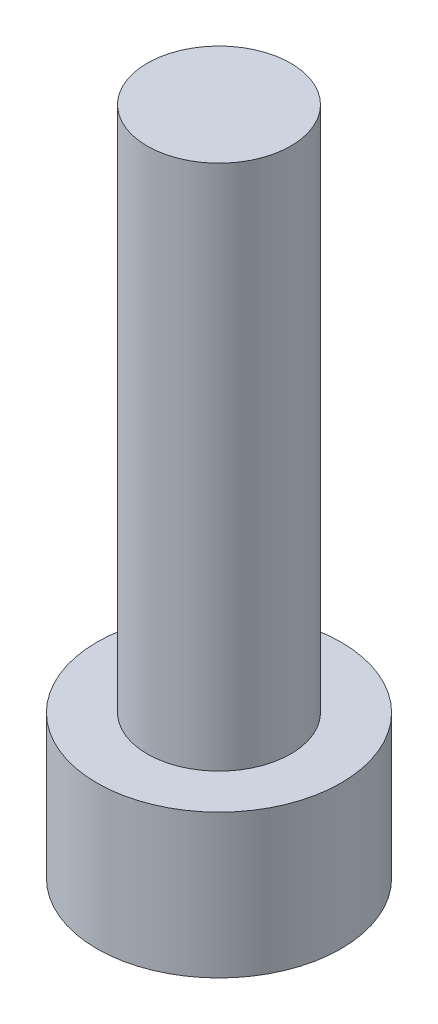
ISO-10303-21;
HEADER;
FILE_DESCRIPTION(('STEP AP214'),'2;1');
FILE_NAME('part.step','',(''),(''),'','','');
FILE_SCHEMA(('AUTOMOTIVE_DESIGN { 1 0 10303 214 1 1 1 1 }'));
ENDSEC;
DATA;
#1=APPLICATION_CONTEXT('core data for automotive mechanical design processes');
#2=APPLICATION_PROTOCOL_DEFINITION('international standard','automotive_design',2000,#1);
#3=PRODUCT_CONTEXT('',#1,'mechanical');
#4=PRODUCT('Part','Part','',(#3));
#5=PRODUCT_RELATED_PRODUCT_CATEGORY('part','',(#4));
#6=PRODUCT_DEFINITION_FORMATION('','',#4);
#7=PRODUCT_DEFINITION_CONTEXT('part definition',#1,'design');
#8=PRODUCT_DEFINITION('design','',#6,#7);
#9=PRODUCT_DEFINITION_SHAPE('','',#8);
#10=(LENGTH_UNIT() NAMED_UNIT(*) SI_UNIT(.MILLI.,.METRE.));
#11=(NAMED_UNIT(*) PLANE_ANGLE_UNIT() SI_UNIT($,.RADIAN.));
#12=(NAMED_UNIT(*) SI_UNIT($,.STERADIAN.) SOLID_ANGLE_UNIT());
#13=UNCERTAINTY_MEASURE_WITH_UNIT(LENGTH_MEASURE(1.E-05),#10,'distance_accuracy_value','');
#14=(GEOMETRIC_REPRESENTATION_CONTEXT(3) GLOBAL_UNCERTAINTY_ASSIGNED_CONTEXT((#13)) GLOBAL_UNIT_ASSIGNED_CONTEXT((#10,
#11,#12)) REPRESENTATION_CONTEXT('',''));
#15=CARTESIAN_POINT('',(0.,0.,0.));
#16=DIRECTION('',(0.,0.,1.));
#17=DIRECTION('',(1.,0.,0.));
#18=AXIS2_PLACEMENT_3D('',#15,#16,#17);
#19=CARTESIAN_POINT('',(0.,6.,0.));
#20=DIRECTION('',(0.,-1.,0.));
#21=DIRECTION('',(0.,0.,-1.));
#22=AXIS2_PLACEMENT_3D('',#19,#20,#21);
#23=CYLINDRICAL_SURFACE('',#22,5.1);
#24=CARTESIAN_POINT('',(0.,6.,0.));
#25=DIRECTION('',(0.,1.,0.));
#26=DIRECTION('',(0.,0.,1.));
#27=AXIS2_PLACEMENT_3D('',#24,#25,#26);
#28=CIRCLE('',#27,5.1);
#29=CARTESIAN_POINT('',(0.,6.,5.1));
#30=VERTEX_POINT('',#29);
#31=EDGE_CURVE('E47',#30,#30,#28,.T.);
#32=ORIENTED_EDGE('',*,*,#31,.F.);
#33=EDGE_LOOP('',(#32));
#34=FACE_BOUND('',#33,.T.);
#35=CARTESIAN_POINT('',(0.,0.,0.));
#36=DIRECTION('',(0.,1.,0.));
#37=DIRECTION('',(0.,0.,1.));
#38=AXIS2_PLACEMENT_3D('',#35,#36,#37);
#39=CIRCLE('',#38,5.1);
#40=CARTESIAN_POINT('',(0.,0.,5.1));
#41=VERTEX_POINT('',#40);
#42=EDGE_CURVE('E42',#41,#41,#39,.T.);
#43=ORIENTED_EDGE('',*,*,#42,.T.);
#44=EDGE_LOOP('',(#43));
#45=FACE_BOUND('',#44,.T.);
#46=ADVANCED_FACE('F41',(#34,#45),#23,.T.);
#47=CARTESIAN_POINT('',(0.,6.,0.));
#48=DIRECTION('',(0.,1.,0.));
#49=DIRECTION('',(0.,0.,1.));
#50=AXIS2_PLACEMENT_3D('',#47,#48,#49);
#51=PLANE('',#50);
#52=CARTESIAN_POINT('',(0.,6.,0.));
#53=DIRECTION('',(0.,1.,0.));
#54=DIRECTION('',(0.,0.,1.));
#55=AXIS2_PLACEMENT_3D('',#52,#53,#54);
#56=CIRCLE('',#55,3.);
#57=CARTESIAN_POINT('',(0.,6.,3.));
#58=VERTEX_POINT('',#57);
#59=EDGE_CURVE('E11',#58,#58,#56,.T.);
#60=ORIENTED_EDGE('',*,*,#59,.F.);
#61=EDGE_LOOP('',(#60));
#62=FACE_BOUND('',#61,.T.);
#63=ORIENTED_EDGE('',*,*,#31,.T.);
#64=EDGE_LOOP('',(#63));
#65=FACE_BOUND('',#64,.T.);
#66=ADVANCED_FACE('F161',(#62,#65),#51,.T.);
#67=CARTESIAN_POINT('',(0.,0.,0.));
#68=DIRECTION('',(0.,1.,0.));
#69=DIRECTION('',(0.,0.,1.));
#70=AXIS2_PLACEMENT_3D('',#67,#68,#69);
#71=PLANE('',#70);
#72=DIRECTION('',(0.091692466270765,0.,0.995787372700209));
#73=VECTOR('',#72,1.);
#74=CARTESIAN_POINT('',(2.3571217565403,0.,-1.66652643488715));
#75=LINE('',#74,#73);
#76=CARTESIAN_POINT('',(2.3571217565403,0.,-1.66652643488715));
#77=VERTEX_POINT('',#76);
#78=CARTESIAN_POINT('',(2.62181510696074,0.,1.20806410353333));
#79=VERTEX_POINT('',#78);
#80=EDGE_CURVE('E133',#77,#79,#75,.T.);
#81=ORIENTED_EDGE('',*,*,#80,.F.);
#82=DIRECTION('',(0.908223394661526,0.,0.418485681223974));
#83=VECTOR('',#82,1.);
#84=CARTESIAN_POINT('',(-0.264693350420435,0.,-2.87459053842048));
#85=LINE('',#84,#83);
#86=CARTESIAN_POINT('',(-0.264693350420435,0.,-2.87459053842048));
#87=VERTEX_POINT('',#86);
#88=EDGE_CURVE('E60',#87,#77,#85,.T.);
#89=ORIENTED_EDGE('',*,*,#88,.F.);
#90=DIRECTION('',(0.816530928390761,0.,-0.577301691476235));
#91=VECTOR('',#90,1.);
#92=CARTESIAN_POINT('',(-2.62181510696074,0.,-1.20806410353333));
#93=LINE('',#92,#91);
#94=CARTESIAN_POINT('',(-2.62181510696074,0.,-1.20806410353333));
#95=VERTEX_POINT('',#94);
#96=EDGE_CURVE('E139',#95,#87,#93,.T.);
#97=ORIENTED_EDGE('',*,*,#96,.F.);
#98=DIRECTION('',(-0.0916924662707653,0.,-0.995787372700209));
#99=VECTOR('',#98,1.);
#100=CARTESIAN_POINT('',(-2.3571217565403,0.,1.66652643488715));
#101=LINE('',#100,#99);
#102=CARTESIAN_POINT('',(-2.3571217565403,0.,1.66652643488715));
#103=VERTEX_POINT('',#102);
#104=EDGE_CURVE('E137',#103,#95,#101,.T.);
#105=ORIENTED_EDGE('',*,*,#104,.F.);
#106=DIRECTION('',(-0.908223394661526,0.,-0.418485681223974));
#107=VECTOR('',#106,1.);
#108=CARTESIAN_POINT('',(0.264693350420435,0.,2.87459053842048));
#109=LINE('',#108,#107);
#110=CARTESIAN_POINT('',(0.264693350420435,0.,2.87459053842048));
#111=VERTEX_POINT('',#110);
#112=EDGE_CURVE('E104',#111,#103,#109,.T.);
#113=ORIENTED_EDGE('',*,*,#112,.F.);
#114=DIRECTION('',(-0.816530928390761,0.,0.577301691476235));
#115=VECTOR('',#114,1.);
#116=CARTESIAN_POINT('',(2.62181510696074,0.,1.20806410353333));
#117=LINE('',#116,#115);
#118=EDGE_CURVE('E135',#79,#111,#117,.T.);
#119=ORIENTED_EDGE('',*,*,#118,.F.);
#120=EDGE_LOOP('',(#81,#89,#97,#105,#113,#119));
#121=FACE_BOUND('',#120,.T.);
#122=ORIENTED_EDGE('',*,*,#42,.F.);
#123=EDGE_LOOP('',(#122));
#124=FACE_BOUND('',#123,.T.);
#125=ADVANCED_FACE('F158',(#121,#124),#71,.F.);
#126=CARTESIAN_POINT('',(0.,28.,0.));
#127=DIRECTION('',(0.,-1.,0.));
#128=DIRECTION('',(0.,0.,-1.));
#129=AXIS2_PLACEMENT_3D('',#126,#127,#128);
#130=CYLINDRICAL_SURFACE('',#129,3.);
#131=CARTESIAN_POINT('',(0.,28.,0.));
#132=DIRECTION('',(0.,1.,0.));
#133=DIRECTION('',(0.,0.,1.));
#134=AXIS2_PLACEMENT_3D('',#131,#132,#133);
#135=CIRCLE('',#134,3.);
#136=CARTESIAN_POINT('',(0.,28.,3.));
#137=VERTEX_POINT('',#136);
#138=EDGE_CURVE('E145',#137,#137,#135,.T.);
#139=ORIENTED_EDGE('',*,*,#138,.F.);
#140=EDGE_LOOP('',(#139));
#141=FACE_BOUND('',#140,.T.);
#142=ORIENTED_EDGE('',*,*,#59,.T.);
#143=EDGE_LOOP('',(#142));
#144=FACE_BOUND('',#143,.T.);
#145=ADVANCED_FACE('F159',(#141,#144),#130,.T.);
#146=CARTESIAN_POINT('',(0.,28.,0.));
#147=DIRECTION('',(0.,1.,0.));
#148=DIRECTION('',(0.,0.,1.));
#149=AXIS2_PLACEMENT_3D('',#146,#147,#148);
#150=PLANE('',#149);
#151=ORIENTED_EDGE('',*,*,#138,.T.);
#152=EDGE_LOOP('',(#151));
#153=FACE_BOUND('',#152,.T.);
#154=ADVANCED_FACE('F169',(#153),#150,.T.);
#155=CARTESIAN_POINT('',(-0.264693350420435,3.,-2.87459053842048));
#156=DIRECTION('',(0.418485681223974,0.,-0.908223394661526));
#157=DIRECTION('',(-0.908223394661526,0.,-0.418485681223974));
#158=AXIS2_PLACEMENT_3D('',#155,#156,#157);
#159=PLANE('',#158);
#160=ORIENTED_EDGE('',*,*,#88,.T.);
#161=DIRECTION('',(0.,-1.,0.));
#162=VECTOR('',#161,1.);
#163=CARTESIAN_POINT('',(2.3571217565403,3.,-1.66652643488715));
#164=LINE('',#163,#162);
#165=CARTESIAN_POINT('',(2.3571217565403,3.,-1.66652643488715));
#166=VERTEX_POINT('',#165);
#167=EDGE_CURVE('E87',#166,#77,#164,.T.);
#168=ORIENTED_EDGE('',*,*,#167,.F.);
#169=DIRECTION('',(0.908223394661526,0.,0.418485681223974));
#170=VECTOR('',#169,1.);
#171=CARTESIAN_POINT('',(-0.264693350420435,3.,-2.87459053842048));
#172=LINE('',#171,#170);
#173=CARTESIAN_POINT('',(-0.264693350420435,3.,-2.87459053842048));
#174=VERTEX_POINT('',#173);
#175=EDGE_CURVE('E142',#174,#166,#172,.T.);
#176=ORIENTED_EDGE('',*,*,#175,.F.);
#177=DIRECTION('',(0.,-1.,0.));
#178=VECTOR('',#177,1.);
#179=CARTESIAN_POINT('',(-0.264693350420435,3.,-2.87459053842048));
#180=LINE('',#179,#178);
#181=EDGE_CURVE('E61',#174,#87,#180,.T.);
#182=ORIENTED_EDGE('',*,*,#181,.T.);
#183=EDGE_LOOP('',(#160,#168,#176,#182));
#184=FACE_BOUND('',#183,.T.);
#185=ADVANCED_FACE('F198',(#184),#159,.F.);
#186=CARTESIAN_POINT('',(-2.62181510696074,3.,-1.20806410353333));
#187=DIRECTION('',(-0.577301691476235,0.,-0.816530928390761));
#188=DIRECTION('',(-0.816530928390761,0.,0.577301691476235));
#189=AXIS2_PLACEMENT_3D('',#186,#187,#188);
#190=PLANE('',#189);
#191=ORIENTED_EDGE('',*,*,#96,.T.);
#192=ORIENTED_EDGE('',*,*,#181,.F.);
#193=DIRECTION('',(0.816530928390761,0.,-0.577301691476235));
#194=VECTOR('',#193,1.);
#195=CARTESIAN_POINT('',(-2.62181510696074,3.,-1.20806410353333));
#196=LINE('',#195,#194);
#197=CARTESIAN_POINT('',(-2.62181510696074,3.,-1.20806410353333));
#198=VERTEX_POINT('',#197);
#199=EDGE_CURVE('E119',#198,#174,#196,.T.);
#200=ORIENTED_EDGE('',*,*,#199,.F.);
#201=DIRECTION('',(0.,-1.,0.));
#202=VECTOR('',#201,1.);
#203=CARTESIAN_POINT('',(-2.62181510696074,3.,-1.20806410353333));
#204=LINE('',#203,#202);
#205=EDGE_CURVE('E108',#198,#95,#204,.T.);
#206=ORIENTED_EDGE('',*,*,#205,.T.);
#207=EDGE_LOOP('',(#191,#192,#200,#206));
#208=FACE_BOUND('',#207,.T.);
#209=ADVANCED_FACE('F208',(#208),#190,.F.);
#210=CARTESIAN_POINT('',(-2.3571217565403,3.,1.66652643488715));
#211=DIRECTION('',(-0.995787372700209,0.,0.0916924662707653));
#212=DIRECTION('',(0.0916924662707653,0.,0.995787372700209));
#213=AXIS2_PLACEMENT_3D('',#210,#211,#212);
#214=PLANE('',#213);
#215=ORIENTED_EDGE('',*,*,#104,.T.);
#216=ORIENTED_EDGE('',*,*,#205,.F.);
#217=DIRECTION('',(-0.0916924662707653,0.,-0.995787372700209));
#218=VECTOR('',#217,1.);
#219=CARTESIAN_POINT('',(-2.3571217565403,3.,1.66652643488715));
#220=LINE('',#219,#218);
#221=CARTESIAN_POINT('',(-2.3571217565403,3.,1.66652643488715));
#222=VERTEX_POINT('',#221);
#223=EDGE_CURVE('E114',#222,#198,#220,.T.);
#224=ORIENTED_EDGE('',*,*,#223,.F.);
#225=DIRECTION('',(0.,-1.,0.));
#226=VECTOR('',#225,1.);
#227=CARTESIAN_POINT('',(-2.3571217565403,3.,1.66652643488715));
#228=LINE('',#227,#226);
#229=EDGE_CURVE('E98',#222,#103,#228,.T.);
#230=ORIENTED_EDGE('',*,*,#229,.T.);
#231=EDGE_LOOP('',(#215,#216,#224,#230));
#232=FACE_BOUND('',#231,.T.);
#233=ADVANCED_FACE('F111',(#232),#214,.F.);
#234=CARTESIAN_POINT('',(0.264693350420435,3.,2.87459053842048));
#235=DIRECTION('',(-0.418485681223974,0.,0.908223394661526));
#236=DIRECTION('',(0.908223394661527,0.,0.418485681223974));
#237=AXIS2_PLACEMENT_3D('',#234,#235,#236);
#238=PLANE('',#237);
#239=ORIENTED_EDGE('',*,*,#112,.T.);
#240=ORIENTED_EDGE('',*,*,#229,.F.);
#241=DIRECTION('',(-0.908223394661526,0.,-0.418485681223974));
#242=VECTOR('',#241,1.);
#243=CARTESIAN_POINT('',(0.264693350420435,3.,2.87459053842048));
#244=LINE('',#243,#242);
#245=CARTESIAN_POINT('',(0.264693350420435,3.,2.87459053842048));
#246=VERTEX_POINT('',#245);
#247=EDGE_CURVE('E105',#246,#222,#244,.T.);
#248=ORIENTED_EDGE('',*,*,#247,.F.);
#249=DIRECTION('',(0.,-1.,0.));
#250=VECTOR('',#249,1.);
#251=CARTESIAN_POINT('',(0.264693350420435,3.,2.87459053842048));
#252=LINE('',#251,#250);
#253=EDGE_CURVE('E109',#246,#111,#252,.T.);
#254=ORIENTED_EDGE('',*,*,#253,.T.);
#255=EDGE_LOOP('',(#239,#240,#248,#254));
#256=FACE_BOUND('',#255,.T.);
#257=ADVANCED_FACE('F99',(#256),#238,.F.);
#258=CARTESIAN_POINT('',(2.62181510696074,3.,1.20806410353333));
#259=DIRECTION('',(0.577301691476235,0.,0.816530928390761));
#260=DIRECTION('',(0.816530928390761,0.,-0.577301691476235));
#261=AXIS2_PLACEMENT_3D('',#258,#259,#260);
#262=PLANE('',#261);
#263=ORIENTED_EDGE('',*,*,#118,.T.);
#264=ORIENTED_EDGE('',*,*,#253,.F.);
#265=DIRECTION('',(-0.816530928390761,0.,0.577301691476235));
#266=VECTOR('',#265,1.);
#267=CARTESIAN_POINT('',(2.62181510696074,3.,1.20806410353333));
#268=LINE('',#267,#266);
#269=CARTESIAN_POINT('',(2.62181510696074,3.,1.20806410353333));
#270=VERTEX_POINT('',#269);
#271=EDGE_CURVE('E122',#270,#246,#268,.T.);
#272=ORIENTED_EDGE('',*,*,#271,.F.);
#273=DIRECTION('',(0.,-1.,0.));
#274=VECTOR('',#273,1.);
#275=CARTESIAN_POINT('',(2.62181510696074,3.,1.20806410353333));
#276=LINE('',#275,#274);
#277=EDGE_CURVE('E150',#270,#79,#276,.T.);
#278=ORIENTED_EDGE('',*,*,#277,.T.);
#279=EDGE_LOOP('',(#263,#264,#272,#278));
#280=FACE_BOUND('',#279,.T.);
#281=ADVANCED_FACE('F232',(#280),#262,.F.);
#282=CARTESIAN_POINT('',(2.3571217565403,3.,-1.66652643488715));
#283=DIRECTION('',(0.995787372700209,0.,-0.091692466270765));
#284=DIRECTION('',(-0.091692466270765,0.,-0.995787372700209));
#285=AXIS2_PLACEMENT_3D('',#282,#283,#284);
#286=PLANE('',#285);
#287=ORIENTED_EDGE('',*,*,#80,.T.);
#288=ORIENTED_EDGE('',*,*,#277,.F.);
#289=DIRECTION('',(0.091692466270765,0.,0.995787372700209));
#290=VECTOR('',#289,1.);
#291=CARTESIAN_POINT('',(2.3571217565403,3.,-1.66652643488715));
#292=LINE('',#291,#290);
#293=EDGE_CURVE('E124',#166,#270,#292,.T.);
#294=ORIENTED_EDGE('',*,*,#293,.F.);
#295=ORIENTED_EDGE('',*,*,#167,.T.);
#296=EDGE_LOOP('',(#287,#288,#294,#295));
#297=FACE_BOUND('',#296,.T.);
#298=ADVANCED_FACE('F244',(#297),#286,.F.);
#299=CARTESIAN_POINT('',(0.,3.,0.));
#300=DIRECTION('',(0.,-1.,0.));
#301=DIRECTION('',(0.,0.,-1.));
#302=AXIS2_PLACEMENT_3D('',#299,#300,#301);
#303=PLANE('',#302);
#304=ORIENTED_EDGE('',*,*,#175,.T.);
#305=ORIENTED_EDGE('',*,*,#293,.T.);
#306=ORIENTED_EDGE('',*,*,#271,.T.);
#307=ORIENTED_EDGE('',*,*,#247,.T.);
#308=ORIENTED_EDGE('',*,*,#223,.T.);
#309=ORIENTED_EDGE('',*,*,#199,.T.);
#310=EDGE_LOOP('',(#304,#305,#306,#307,#308,#309));
#311=FACE_BOUND('',#310,.T.);
#312=ADVANCED_FACE('F116',(#311),#303,.T.);
#313=CLOSED_SHELL('',(#46,#66,#125,#145,#154,#185,#209,#233,#257,#281,#298,#312));
#314=MANIFOLD_SOLID_BREP('B2',#313);
#315=ADVANCED_BREP_SHAPE_REPRESENTATION('',(#18,#314),#14);
#316=SHAPE_DEFINITION_REPRESENTATION(#9,#315);
ENDSEC;
END-ISO-10303-21;
